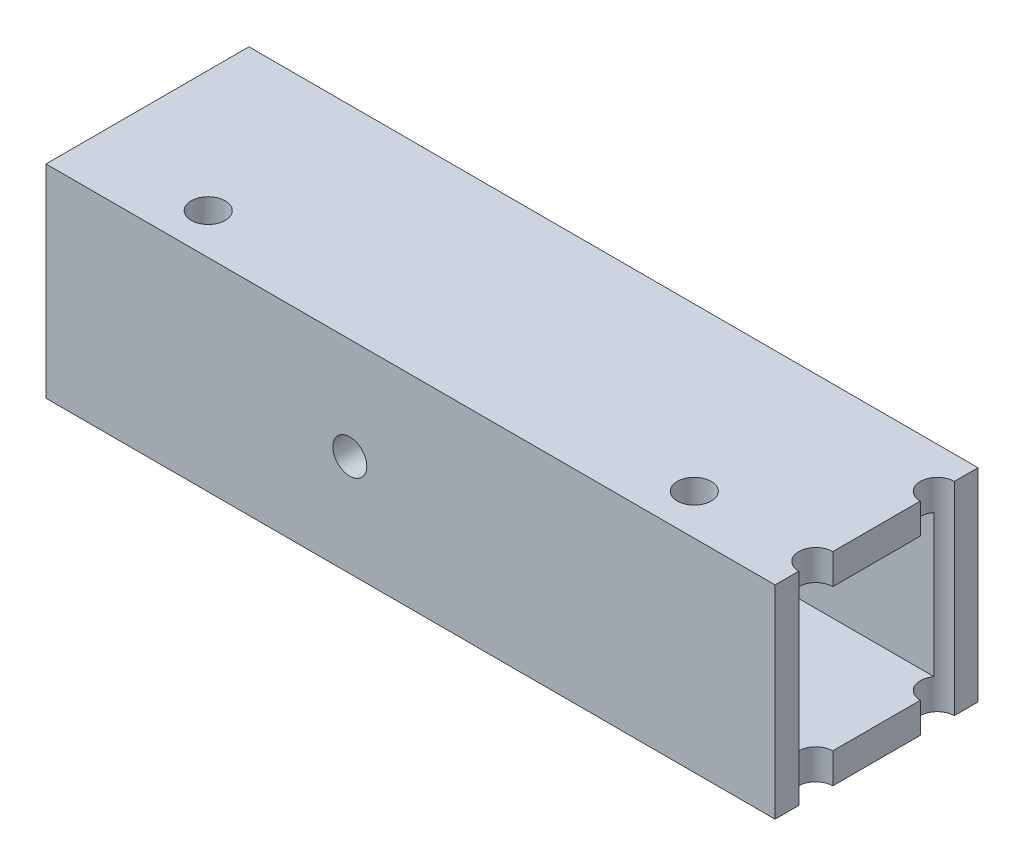
ISO-10303-21;
HEADER;
FILE_DESCRIPTION(('STEP AP214'),'2;1');
FILE_NAME('part.step','',(''),(''),'','','');
FILE_SCHEMA(('AUTOMOTIVE_DESIGN { 1 0 10303 214 1 1 1 1 }'));
ENDSEC;
DATA;
#1=APPLICATION_CONTEXT('core data for automotive mechanical design processes');
#2=APPLICATION_PROTOCOL_DEFINITION('international standard','automotive_design',2000,#1);
#3=PRODUCT_CONTEXT('',#1,'mechanical');
#4=PRODUCT('Part','Part','',(#3));
#5=PRODUCT_RELATED_PRODUCT_CATEGORY('part','',(#4));
#6=PRODUCT_DEFINITION_FORMATION('','',#4);
#7=PRODUCT_DEFINITION_CONTEXT('part definition',#1,'design');
#8=PRODUCT_DEFINITION('design','',#6,#7);
#9=PRODUCT_DEFINITION_SHAPE('','',#8);
#10=(LENGTH_UNIT() NAMED_UNIT(*) SI_UNIT(.MILLI.,.METRE.));
#11=(NAMED_UNIT(*) PLANE_ANGLE_UNIT() SI_UNIT($,.RADIAN.));
#12=(NAMED_UNIT(*) SI_UNIT($,.STERADIAN.) SOLID_ANGLE_UNIT());
#13=UNCERTAINTY_MEASURE_WITH_UNIT(LENGTH_MEASURE(1.E-05),#10,'distance_accuracy_value','');
#14=(GEOMETRIC_REPRESENTATION_CONTEXT(3) GLOBAL_UNCERTAINTY_ASSIGNED_CONTEXT((#13)) GLOBAL_UNIT_ASSIGNED_CONTEXT((#10,
#11,#12)) REPRESENTATION_CONTEXT('',''));
#15=CARTESIAN_POINT('',(0.,0.,0.));
#16=DIRECTION('',(0.,0.,1.));
#17=DIRECTION('',(1.,0.,0.));
#18=AXIS2_PLACEMENT_3D('',#15,#16,#17);
#19=CARTESIAN_POINT('',(-151.,-133.7,131.7));
#20=DIRECTION('',(0.,0.,1.));
#21=DIRECTION('',(1.,0.,0.));
#22=AXIS2_PLACEMENT_3D('',#19,#20,#21);
#23=PLANE('',#22);
#24=CARTESIAN_POINT('',(-100.,-122.,131.7));
#25=DIRECTION('',(0.,0.,1.));
#26=DIRECTION('',(1.,0.,0.));
#27=AXIS2_PLACEMENT_3D('',#24,#25,#26);
#28=CIRCLE('',#27,2.8);
#29=CARTESIAN_POINT('',(-97.2,-122.,131.7));
#30=VERTEX_POINT('',#29);
#31=EDGE_CURVE('E29',#30,#30,#28,.T.);
#32=ORIENTED_EDGE('',*,*,#31,.T.);
#33=EDGE_LOOP('',(#32));
#34=FACE_BOUND('',#33,.T.);
#35=DIRECTION('',(0.,-1.,0.));
#36=VECTOR('',#35,1.);
#37=CARTESIAN_POINT('',(-52.22485954612,-100.,131.7));
#38=LINE('',#37,#36);
#39=CARTESIAN_POINT('',(-52.22485954613,-110.3,131.7));
#40=VERTEX_POINT('',#39);
#41=CARTESIAN_POINT('',(-52.22485954613,-133.7,131.7));
#42=VERTEX_POINT('',#41);
#43=EDGE_CURVE('E320',#40,#42,#38,.T.);
#44=ORIENTED_EDGE('',*,*,#43,.T.);
#45=DIRECTION('',(1.,0.,0.));
#46=VECTOR('',#45,1.);
#47=CARTESIAN_POINT('',(-151.,-133.7,131.7));
#48=LINE('',#47,#46);
#49=CARTESIAN_POINT('',(-127.7751404538,-133.7,131.7));
#50=VERTEX_POINT('',#49);
#51=EDGE_CURVE('E333',#50,#42,#48,.T.);
#52=ORIENTED_EDGE('',*,*,#51,.F.);
#53=DIRECTION('',(0.,-1.,0.));
#54=VECTOR('',#53,1.);
#55=CARTESIAN_POINT('',(-127.7751404538,-100.,131.7));
#56=LINE('',#55,#54);
#57=CARTESIAN_POINT('',(-127.7751404538,-110.3,131.7));
#58=VERTEX_POINT('',#57);
#59=EDGE_CURVE('E312',#58,#50,#56,.T.);
#60=ORIENTED_EDGE('',*,*,#59,.F.);
#61=DIRECTION('',(1.,0.,0.));
#62=VECTOR('',#61,1.);
#63=CARTESIAN_POINT('',(-151.,-110.3,131.7));
#64=LINE('',#63,#62);
#65=EDGE_CURVE('E348',#58,#40,#64,.T.);
#66=ORIENTED_EDGE('',*,*,#65,.T.);
#67=EDGE_LOOP('',(#44,#52,#60,#66));
#68=FACE_BOUND('',#67,.T.);
#69=ADVANCED_FACE('F20',(#34,#68),#23,.F.);
#70=CARTESIAN_POINT('',(-151.,-133.7,131.7));
#71=DIRECTION('',(0.,0.,1.));
#72=DIRECTION('',(1.,0.,0.));
#73=AXIS2_PLACEMENT_3D('',#70,#71,#72);
#74=PLANE('',#73);
#75=DIRECTION('',(0.,-1.,0.));
#76=VECTOR('',#75,1.);
#77=CARTESIAN_POINT('',(-32.22485954612,-100.,131.7));
#78=LINE('',#77,#76);
#79=CARTESIAN_POINT('',(-32.22485954613,-110.3,131.7));
#80=VERTEX_POINT('',#79);
#81=CARTESIAN_POINT('',(-32.22485954613,-133.7,131.7));
#82=VERTEX_POINT('',#81);
#83=EDGE_CURVE('E214',#80,#82,#78,.T.);
#84=ORIENTED_EDGE('',*,*,#83,.T.);
#85=DIRECTION('',(1.,0.,0.));
#86=VECTOR('',#85,1.);
#87=CARTESIAN_POINT('',(-151.,-133.7,131.7));
#88=LINE('',#87,#86);
#89=CARTESIAN_POINT('',(-47.77514045387,-133.7,131.7));
#90=VERTEX_POINT('',#89);
#91=EDGE_CURVE('E229',#90,#82,#88,.T.);
#92=ORIENTED_EDGE('',*,*,#91,.F.);
#93=DIRECTION('',(0.,-1.,0.));
#94=VECTOR('',#93,1.);
#95=CARTESIAN_POINT('',(-47.77514045387,-100.,131.7));
#96=LINE('',#95,#94);
#97=CARTESIAN_POINT('',(-47.77514045387,-110.3,131.7));
#98=VERTEX_POINT('',#97);
#99=EDGE_CURVE('E316',#98,#90,#96,.T.);
#100=ORIENTED_EDGE('',*,*,#99,.F.);
#101=DIRECTION('',(1.,0.,0.));
#102=VECTOR('',#101,1.);
#103=CARTESIAN_POINT('',(-151.,-110.3,131.7));
#104=LINE('',#103,#102);
#105=EDGE_CURVE('E395',#98,#80,#104,.T.);
#106=ORIENTED_EDGE('',*,*,#105,.T.);
#107=EDGE_LOOP('',(#84,#92,#100,#106));
#108=FACE_BOUND('',#107,.T.);
#109=ADVANCED_FACE('F394',(#108),#74,.F.);
#110=CARTESIAN_POINT('',(-30.,-138.7,103.3));
#111=DIRECTION('',(1.,0.,0.));
#112=DIRECTION('',(0.,1.,0.));
#113=AXIS2_PLACEMENT_3D('',#110,#111,#112);
#114=PLANE('',#113);
#115=DIRECTION('',(0.,-1.,0.));
#116=VECTOR('',#115,1.);
#117=CARTESIAN_POINT('',(-30.,-100.,112.8));
#118=LINE('',#117,#116);
#119=CARTESIAN_POINT('',(-30.,-105.3,112.79999999999));
#120=VERTEX_POINT('',#119);
#121=CARTESIAN_POINT('',(-30.,-110.3,112.79999999999));
#122=VERTEX_POINT('',#121);
#123=EDGE_CURVE('E245',#120,#122,#118,.T.);
#124=ORIENTED_EDGE('',*,*,#123,.F.);
#125=DIRECTION('',(0.,0.,1.));
#126=VECTOR('',#125,1.);
#127=CARTESIAN_POINT('',(-30.,-105.3,103.3));
#128=LINE('',#127,#126);
#129=CARTESIAN_POINT('',(-30.,-105.3,127.2));
#130=VERTEX_POINT('',#129);
#131=EDGE_CURVE('E413',#120,#130,#128,.T.);
#132=ORIENTED_EDGE('',*,*,#131,.T.);
#133=DIRECTION('',(0.,-1.,0.));
#134=VECTOR('',#133,1.);
#135=CARTESIAN_POINT('',(-30.,-100.,127.2));
#136=LINE('',#135,#134);
#137=CARTESIAN_POINT('',(-30.,-110.3,127.2));
#138=VERTEX_POINT('',#137);
#139=EDGE_CURVE('E300',#130,#138,#136,.T.);
#140=ORIENTED_EDGE('',*,*,#139,.T.);
#141=DIRECTION('',(0.,0.,1.));
#142=VECTOR('',#141,1.);
#143=CARTESIAN_POINT('',(-30.,-110.3,105.8));
#144=LINE('',#143,#142);
#145=EDGE_CURVE('E459',#122,#138,#144,.T.);
#146=ORIENTED_EDGE('',*,*,#145,.F.);
#147=EDGE_LOOP('',(#124,#132,#140,#146));
#148=FACE_BOUND('',#147,.T.);
#149=ADVANCED_FACE('F550',(#148),#114,.T.);
#150=CARTESIAN_POINT('',(-100.,-122.,98.));
#151=DIRECTION('',(0.,0.,1.));
#152=DIRECTION('',(1.,0.,0.));
#153=AXIS2_PLACEMENT_3D('',#150,#151,#152);
#154=CYLINDRICAL_SURFACE('',#153,2.8);
#155=DIRECTION('',(0.,0.,1.));
#156=VECTOR('',#155,1.);
#157=CARTESIAN_POINT('',(-97.2,-122.,98.));
#158=LINE('',#157,#156);
#159=CARTESIAN_POINT('',(-97.2,-122.,103.3));
#160=VERTEX_POINT('',#159);
#161=CARTESIAN_POINT('',(-97.2,-122.,108.3));
#162=VERTEX_POINT('',#161);
#163=EDGE_CURVE('E12',#160,#162,#158,.T.);
#164=ORIENTED_EDGE('',*,*,#163,.F.);
#165=CARTESIAN_POINT('',(-100.,-122.,103.3));
#166=DIRECTION('',(0.,0.,1.));
#167=DIRECTION('',(1.,0.,0.));
#168=AXIS2_PLACEMENT_3D('',#165,#166,#167);
#169=CIRCLE('',#168,2.8);
#170=EDGE_CURVE('E685',#160,#160,#169,.T.);
#171=ORIENTED_EDGE('',*,*,#170,.F.);
#172=ORIENTED_EDGE('',*,*,#163,.T.);
#173=CARTESIAN_POINT('',(-100.,-122.,108.3));
#174=DIRECTION('',(0.,0.,1.));
#175=DIRECTION('',(1.,0.,0.));
#176=AXIS2_PLACEMENT_3D('',#173,#174,#175);
#177=CIRCLE('',#176,2.8);
#178=EDGE_CURVE('E460',#162,#162,#177,.T.);
#179=ORIENTED_EDGE('',*,*,#178,.T.);
#180=EDGE_LOOP('',(#164,#171,#172,#179));
#181=FACE_BOUND('',#180,.T.);
#182=ADVANCED_FACE('F749',(#181),#154,.F.);
#183=CARTESIAN_POINT('',(-100.,-122.,98.));
#184=DIRECTION('',(0.,0.,1.));
#185=DIRECTION('',(1.,0.,0.));
#186=AXIS2_PLACEMENT_3D('',#183,#184,#185);
#187=CYLINDRICAL_SURFACE('',#186,2.8);
#188=DIRECTION('',(0.,0.,1.));
#189=VECTOR('',#188,1.);
#190=CARTESIAN_POINT('',(-97.2,-122.,98.));
#191=LINE('',#190,#189);
#192=CARTESIAN_POINT('',(-97.2,-122.,136.7));
#193=VERTEX_POINT('',#192);
#194=EDGE_CURVE('E313',#30,#193,#191,.T.);
#195=ORIENTED_EDGE('',*,*,#194,.F.);
#196=ORIENTED_EDGE('',*,*,#31,.F.);
#197=ORIENTED_EDGE('',*,*,#194,.T.);
#198=CARTESIAN_POINT('',(-100.,-122.,136.7));
#199=DIRECTION('',(0.,0.,1.));
#200=DIRECTION('',(1.,0.,0.));
#201=AXIS2_PLACEMENT_3D('',#198,#199,#200);
#202=CIRCLE('',#201,2.8);
#203=EDGE_CURVE('E440',#193,#193,#202,.T.);
#204=ORIENTED_EDGE('',*,*,#203,.T.);
#205=EDGE_LOOP('',(#195,#196,#197,#204));
#206=FACE_BOUND('',#205,.T.);
#207=ADVANCED_FACE('F744',(#206),#187,.F.);
#208=CARTESIAN_POINT('',(-50.,-100.,130.));
#209=DIRECTION('',(0.,-1.,0.));
#210=DIRECTION('',(1.,0.,0.));
#211=AXIS2_PLACEMENT_3D('',#208,#209,#210);
#212=CYLINDRICAL_SURFACE('',#211,2.8);
#213=DIRECTION('',(0.,-1.,0.));
#214=VECTOR('',#213,1.);
#215=CARTESIAN_POINT('',(-47.2,-100.,130.));
#216=LINE('',#215,#214);
#217=CARTESIAN_POINT('',(-47.2,-133.7,130.));
#218=VERTEX_POINT('',#217);
#219=CARTESIAN_POINT('',(-47.2,-138.7,130.));
#220=VERTEX_POINT('',#219);
#221=EDGE_CURVE('E319',#218,#220,#216,.T.);
#222=ORIENTED_EDGE('',*,*,#221,.F.);
#223=CARTESIAN_POINT('',(-50.,-133.7,130.));
#224=DIRECTION('',(0.,-1.,0.));
#225=DIRECTION('',(1.,0.,0.));
#226=AXIS2_PLACEMENT_3D('',#223,#224,#225);
#227=CIRCLE('',#226,2.8);
#228=EDGE_CURVE('E270',#42,#218,#227,.T.);
#229=ORIENTED_EDGE('',*,*,#228,.F.);
#230=ORIENTED_EDGE('',*,*,#43,.F.);
#231=CARTESIAN_POINT('',(-50.,-110.3,130.));
#232=DIRECTION('',(0.,-1.,0.));
#233=DIRECTION('',(1.,0.,0.));
#234=AXIS2_PLACEMENT_3D('',#231,#232,#233);
#235=CIRCLE('',#234,2.8);
#236=CARTESIAN_POINT('',(-47.2,-110.3,130.));
#237=VERTEX_POINT('',#236);
#238=EDGE_CURVE('E346',#40,#237,#235,.T.);
#239=ORIENTED_EDGE('',*,*,#238,.T.);
#240=DIRECTION('',(0.,-1.,0.));
#241=VECTOR('',#240,1.);
#242=CARTESIAN_POINT('',(-47.2,-100.,130.));
#243=LINE('',#242,#241);
#244=CARTESIAN_POINT('',(-47.2,-105.3,130.));
#245=VERTEX_POINT('',#244);
#246=EDGE_CURVE('E323',#245,#237,#243,.T.);
#247=ORIENTED_EDGE('',*,*,#246,.F.);
#248=CARTESIAN_POINT('',(-50.,-105.3,130.));
#249=DIRECTION('',(0.,-1.,0.));
#250=DIRECTION('',(1.,0.,0.));
#251=AXIS2_PLACEMENT_3D('',#248,#249,#250);
#252=CIRCLE('',#251,2.8);
#253=EDGE_CURVE('E423',#245,#245,#252,.T.);
#254=ORIENTED_EDGE('',*,*,#253,.F.);
#255=ORIENTED_EDGE('',*,*,#246,.T.);
#256=CARTESIAN_POINT('',(-50.,-110.3,130.));
#257=DIRECTION('',(0.,-1.,0.));
#258=DIRECTION('',(1.,0.,0.));
#259=AXIS2_PLACEMENT_3D('',#256,#257,#258);
#260=CIRCLE('',#259,2.8);
#261=EDGE_CURVE('E291',#237,#98,#260,.T.);
#262=ORIENTED_EDGE('',*,*,#261,.T.);
#263=ORIENTED_EDGE('',*,*,#99,.T.);
#264=CARTESIAN_POINT('',(-50.,-133.7,130.));
#265=DIRECTION('',(0.,-1.,0.));
#266=DIRECTION('',(1.,0.,0.));
#267=AXIS2_PLACEMENT_3D('',#264,#265,#266);
#268=CIRCLE('',#267,2.8);
#269=EDGE_CURVE('E235',#218,#90,#268,.T.);
#270=ORIENTED_EDGE('',*,*,#269,.F.);
#271=ORIENTED_EDGE('',*,*,#221,.T.);
#272=CARTESIAN_POINT('',(-50.,-138.7,130.));
#273=DIRECTION('',(0.,-1.,0.));
#274=DIRECTION('',(1.,0.,0.));
#275=AXIS2_PLACEMENT_3D('',#272,#273,#274);
#276=CIRCLE('',#275,2.8);
#277=EDGE_CURVE('E289',#220,#220,#276,.T.);
#278=ORIENTED_EDGE('',*,*,#277,.T.);
#279=EDGE_LOOP('',(#222,#229,#230,#239,#247,#254,#255,#262,#263,#270,#271,#278));
#280=FACE_BOUND('',#279,.T.);
#281=ADVANCED_FACE('F384',(#280),#212,.F.);
#282=CARTESIAN_POINT('',(-130.,-100.,130.));
#283=DIRECTION('',(0.,-1.,0.));
#284=DIRECTION('',(1.,0.,0.));
#285=AXIS2_PLACEMENT_3D('',#282,#283,#284);
#286=CYLINDRICAL_SURFACE('',#285,2.8);
#287=DIRECTION('',(0.,-1.,0.));
#288=VECTOR('',#287,1.);
#289=CARTESIAN_POINT('',(-127.2,-100.,130.));
#290=LINE('',#289,#288);
#291=CARTESIAN_POINT('',(-127.2,-133.7,130.));
#292=VERTEX_POINT('',#291);
#293=CARTESIAN_POINT('',(-127.2,-138.7,130.));
#294=VERTEX_POINT('',#293);
#295=EDGE_CURVE('E306',#292,#294,#290,.T.);
#296=ORIENTED_EDGE('',*,*,#295,.F.);
#297=CARTESIAN_POINT('',(-130.,-133.7,130.));
#298=DIRECTION('',(0.,-1.,0.));
#299=DIRECTION('',(1.,0.,0.));
#300=AXIS2_PLACEMENT_3D('',#297,#298,#299);
#301=CIRCLE('',#300,2.8);
#302=CARTESIAN_POINT('',(-132.2248595461,-133.7,131.7));
#303=VERTEX_POINT('',#302);
#304=EDGE_CURVE('E343',#303,#292,#301,.T.);
#305=ORIENTED_EDGE('',*,*,#304,.F.);
#306=DIRECTION('',(0.,-1.,0.));
#307=VECTOR('',#306,1.);
#308=CARTESIAN_POINT('',(-132.2248595461,-100.,131.7));
#309=LINE('',#308,#307);
#310=CARTESIAN_POINT('',(-132.2248595461,-110.3,131.7));
#311=VERTEX_POINT('',#310);
#312=EDGE_CURVE('E366',#311,#303,#309,.T.);
#313=ORIENTED_EDGE('',*,*,#312,.F.);
#314=CARTESIAN_POINT('',(-130.,-110.3,130.));
#315=DIRECTION('',(0.,-1.,0.));
#316=DIRECTION('',(1.,0.,0.));
#317=AXIS2_PLACEMENT_3D('',#314,#315,#316);
#318=CIRCLE('',#317,2.8);
#319=CARTESIAN_POINT('',(-127.2,-110.3,130.));
#320=VERTEX_POINT('',#319);
#321=EDGE_CURVE('E358',#311,#320,#318,.T.);
#322=ORIENTED_EDGE('',*,*,#321,.T.);
#323=DIRECTION('',(0.,-1.,0.));
#324=VECTOR('',#323,1.);
#325=CARTESIAN_POINT('',(-127.2,-100.,130.));
#326=LINE('',#325,#324);
#327=CARTESIAN_POINT('',(-127.2,-105.3,130.));
#328=VERTEX_POINT('',#327);
#329=EDGE_CURVE('E309',#328,#320,#326,.T.);
#330=ORIENTED_EDGE('',*,*,#329,.F.);
#331=CARTESIAN_POINT('',(-130.,-105.3,130.));
#332=DIRECTION('',(0.,-1.,0.));
#333=DIRECTION('',(1.,0.,0.));
#334=AXIS2_PLACEMENT_3D('',#331,#332,#333);
#335=CIRCLE('',#334,2.8);
#336=EDGE_CURVE('E418',#328,#328,#335,.T.);
#337=ORIENTED_EDGE('',*,*,#336,.F.);
#338=ORIENTED_EDGE('',*,*,#329,.T.);
#339=CARTESIAN_POINT('',(-130.,-110.3,130.));
#340=DIRECTION('',(0.,-1.,0.));
#341=DIRECTION('',(1.,0.,0.));
#342=AXIS2_PLACEMENT_3D('',#339,#340,#341);
#343=CIRCLE('',#342,2.8);
#344=EDGE_CURVE('E352',#320,#58,#343,.T.);
#345=ORIENTED_EDGE('',*,*,#344,.T.);
#346=ORIENTED_EDGE('',*,*,#59,.T.);
#347=CARTESIAN_POINT('',(-130.,-133.7,130.));
#348=DIRECTION('',(0.,-1.,0.));
#349=DIRECTION('',(1.,0.,0.));
#350=AXIS2_PLACEMENT_3D('',#347,#348,#349);
#351=CIRCLE('',#350,2.8);
#352=EDGE_CURVE('E329',#292,#50,#351,.T.);
#353=ORIENTED_EDGE('',*,*,#352,.F.);
#354=ORIENTED_EDGE('',*,*,#295,.T.);
#355=CARTESIAN_POINT('',(-130.,-138.7,130.));
#356=DIRECTION('',(0.,-1.,0.));
#357=DIRECTION('',(1.,0.,0.));
#358=AXIS2_PLACEMENT_3D('',#355,#356,#357);
#359=CIRCLE('',#358,2.8);
#360=EDGE_CURVE('E284',#294,#294,#359,.T.);
#361=ORIENTED_EDGE('',*,*,#360,.T.);
#362=EDGE_LOOP('',(#296,#305,#313,#322,#330,#337,#338,#345,#346,#353,#354,#361));
#363=FACE_BOUND('',#362,.T.);
#364=ADVANCED_FACE('F376',(#363),#286,.F.);
#365=CARTESIAN_POINT('',(-30.,-138.7,103.3));
#366=DIRECTION('',(1.,0.,0.));
#367=DIRECTION('',(0.,1.,0.));
#368=AXIS2_PLACEMENT_3D('',#365,#366,#367);
#369=PLANE('',#368);
#370=DIRECTION('',(0.,0.,1.));
#371=VECTOR('',#370,1.);
#372=CARTESIAN_POINT('',(-30.,-138.7,103.3));
#373=LINE('',#372,#371);
#374=CARTESIAN_POINT('',(-30.,-138.7,132.8));
#375=VERTEX_POINT('',#374);
#376=CARTESIAN_POINT('',(-30.,-138.7,136.7));
#377=VERTEX_POINT('',#376);
#378=EDGE_CURVE('E258',#375,#377,#373,.T.);
#379=ORIENTED_EDGE('',*,*,#378,.F.);
#380=DIRECTION('',(0.,-1.,0.));
#381=VECTOR('',#380,1.);
#382=CARTESIAN_POINT('',(-30.,-100.,132.8));
#383=LINE('',#382,#381);
#384=CARTESIAN_POINT('',(-30.,-105.3,132.8));
#385=VERTEX_POINT('',#384);
#386=EDGE_CURVE('E303',#385,#375,#383,.T.);
#387=ORIENTED_EDGE('',*,*,#386,.F.);
#388=DIRECTION('',(0.,0.,1.));
#389=VECTOR('',#388,1.);
#390=CARTESIAN_POINT('',(-30.,-105.3,103.3));
#391=LINE('',#390,#389);
#392=CARTESIAN_POINT('',(-30.,-105.3,136.7));
#393=VERTEX_POINT('',#392);
#394=EDGE_CURVE('E406',#385,#393,#391,.T.);
#395=ORIENTED_EDGE('',*,*,#394,.T.);
#396=DIRECTION('',(0.,1.,0.));
#397=VECTOR('',#396,1.);
#398=CARTESIAN_POINT('',(-30.,-138.7,136.7));
#399=LINE('',#398,#397);
#400=EDGE_CURVE('E562',#377,#393,#399,.T.);
#401=ORIENTED_EDGE('',*,*,#400,.F.);
#402=EDGE_LOOP('',(#379,#387,#395,#401));
#403=FACE_BOUND('',#402,.T.);
#404=ADVANCED_FACE('F561',(#403),#369,.T.);
#405=CARTESIAN_POINT('',(-30.,-100.,130.));
#406=DIRECTION('',(0.,-1.,0.));
#407=DIRECTION('',(1.,0.,0.));
#408=AXIS2_PLACEMENT_3D('',#405,#406,#407);
#409=CYLINDRICAL_SURFACE('',#408,2.8);
#410=DIRECTION('',(0.,-1.,0.));
#411=VECTOR('',#410,1.);
#412=CARTESIAN_POINT('',(-30.,-100.,127.2));
#413=LINE('',#412,#411);
#414=CARTESIAN_POINT('',(-30.,-133.7,127.2));
#415=VERTEX_POINT('',#414);
#416=CARTESIAN_POINT('',(-30.,-138.7,127.2));
#417=VERTEX_POINT('',#416);
#418=EDGE_CURVE('E200',#415,#417,#413,.T.);
#419=ORIENTED_EDGE('',*,*,#418,.F.);
#420=CARTESIAN_POINT('',(-30.,-133.7,130.));
#421=DIRECTION('',(0.,-1.,0.));
#422=DIRECTION('',(1.,0.,0.));
#423=AXIS2_PLACEMENT_3D('',#420,#421,#422);
#424=CIRCLE('',#423,2.8);
#425=EDGE_CURVE('E204',#82,#415,#424,.T.);
#426=ORIENTED_EDGE('',*,*,#425,.F.);
#427=ORIENTED_EDGE('',*,*,#83,.F.);
#428=CARTESIAN_POINT('',(-30.,-110.3,130.));
#429=DIRECTION('',(0.,-1.,0.));
#430=DIRECTION('',(1.,0.,0.));
#431=AXIS2_PLACEMENT_3D('',#428,#429,#430);
#432=CIRCLE('',#431,2.8);
#433=EDGE_CURVE('E534',#80,#138,#432,.T.);
#434=ORIENTED_EDGE('',*,*,#433,.T.);
#435=ORIENTED_EDGE('',*,*,#139,.F.);
#436=CARTESIAN_POINT('',(-30.,-105.3,130.));
#437=DIRECTION('',(0.,-1.,0.));
#438=DIRECTION('',(1.,0.,0.));
#439=AXIS2_PLACEMENT_3D('',#436,#437,#438);
#440=CIRCLE('',#439,2.8);
#441=EDGE_CURVE('E409',#385,#130,#440,.T.);
#442=ORIENTED_EDGE('',*,*,#441,.F.);
#443=ORIENTED_EDGE('',*,*,#386,.T.);
#444=CARTESIAN_POINT('',(-30.,-138.7,130.));
#445=DIRECTION('',(0.,-1.,0.));
#446=DIRECTION('',(1.,0.,0.));
#447=AXIS2_PLACEMENT_3D('',#444,#445,#446);
#448=CIRCLE('',#447,2.8);
#449=EDGE_CURVE('E209',#375,#417,#448,.T.);
#450=ORIENTED_EDGE('',*,*,#449,.T.);
#451=EDGE_LOOP('',(#419,#426,#427,#434,#435,#442,#443,#450));
#452=FACE_BOUND('',#451,.T.);
#453=ADVANCED_FACE('F202',(#452),#409,.F.);
#454=CARTESIAN_POINT('',(-30.,-138.7,103.3));
#455=DIRECTION('',(1.,0.,0.));
#456=DIRECTION('',(0.,1.,0.));
#457=AXIS2_PLACEMENT_3D('',#454,#455,#456);
#458=PLANE('',#457);
#459=DIRECTION('',(0.,0.,1.));
#460=VECTOR('',#459,1.);
#461=CARTESIAN_POINT('',(-30.,-138.7,103.3));
#462=LINE('',#461,#460);
#463=CARTESIAN_POINT('',(-30.,-138.7,112.79999999999));
#464=VERTEX_POINT('',#463);
#465=EDGE_CURVE('E469',#464,#417,#462,.T.);
#466=ORIENTED_EDGE('',*,*,#465,.F.);
#467=DIRECTION('',(0.,-1.,0.));
#468=VECTOR('',#467,1.);
#469=CARTESIAN_POINT('',(-30.,-100.,112.8));
#470=LINE('',#469,#468);
#471=CARTESIAN_POINT('',(-30.,-133.7,112.79999999999));
#472=VERTEX_POINT('',#471);
#473=EDGE_CURVE('E215',#472,#464,#470,.T.);
#474=ORIENTED_EDGE('',*,*,#473,.F.);
#475=DIRECTION('',(0.,0.,1.));
#476=VECTOR('',#475,1.);
#477=CARTESIAN_POINT('',(-30.,-133.7,105.8));
#478=LINE('',#477,#476);
#479=EDGE_CURVE('E218',#472,#415,#478,.T.);
#480=ORIENTED_EDGE('',*,*,#479,.T.);
#481=ORIENTED_EDGE('',*,*,#418,.T.);
#482=EDGE_LOOP('',(#466,#474,#480,#481));
#483=FACE_BOUND('',#482,.T.);
#484=ADVANCED_FACE('F219',(#483),#458,.T.);
#485=CARTESIAN_POINT('',(-30.,-100.,110.));
#486=DIRECTION('',(0.,-1.,0.));
#487=DIRECTION('',(1.,0.,0.));
#488=AXIS2_PLACEMENT_3D('',#485,#486,#487);
#489=CYLINDRICAL_SURFACE('',#488,2.8);
#490=DIRECTION('',(0.,-1.,0.));
#491=VECTOR('',#490,1.);
#492=CARTESIAN_POINT('',(-30.,-100.,107.2));
#493=LINE('',#492,#491);
#494=CARTESIAN_POINT('',(-30.,-105.3,107.2));
#495=VERTEX_POINT('',#494);
#496=CARTESIAN_POINT('',(-30.,-138.7,107.2));
#497=VERTEX_POINT('',#496);
#498=EDGE_CURVE('E240',#495,#497,#493,.T.);
#499=ORIENTED_EDGE('',*,*,#498,.F.);
#500=CARTESIAN_POINT('',(-30.,-105.3,110.));
#501=DIRECTION('',(0.,-1.,0.));
#502=DIRECTION('',(1.,0.,0.));
#503=AXIS2_PLACEMENT_3D('',#500,#501,#502);
#504=CIRCLE('',#503,2.8);
#505=EDGE_CURVE('E417',#120,#495,#504,.T.);
#506=ORIENTED_EDGE('',*,*,#505,.F.);
#507=ORIENTED_EDGE('',*,*,#123,.T.);
#508=CARTESIAN_POINT('',(-30.,-110.3,110.));
#509=DIRECTION('',(0.,-1.,0.));
#510=DIRECTION('',(1.,0.,0.));
#511=AXIS2_PLACEMENT_3D('',#508,#509,#510);
#512=CIRCLE('',#511,2.8);
#513=CARTESIAN_POINT('',(-32.22485954612,-110.3,108.3));
#514=VERTEX_POINT('',#513);
#515=EDGE_CURVE('E455',#122,#514,#512,.T.);
#516=ORIENTED_EDGE('',*,*,#515,.T.);
#517=DIRECTION('',(0.,-1.,0.));
#518=VECTOR('',#517,1.);
#519=CARTESIAN_POINT('',(-32.22485954612,-100.,108.3));
#520=LINE('',#519,#518);
#521=CARTESIAN_POINT('',(-32.22485954612,-133.7,108.3));
#522=VERTEX_POINT('',#521);
#523=EDGE_CURVE('E461',#514,#522,#520,.T.);
#524=ORIENTED_EDGE('',*,*,#523,.T.);
#525=CARTESIAN_POINT('',(-30.,-133.7,110.));
#526=DIRECTION('',(0.,-1.,0.));
#527=DIRECTION('',(1.,0.,0.));
#528=AXIS2_PLACEMENT_3D('',#525,#526,#527);
#529=CIRCLE('',#528,2.8);
#530=EDGE_CURVE('E224',#472,#522,#529,.T.);
#531=ORIENTED_EDGE('',*,*,#530,.F.);
#532=ORIENTED_EDGE('',*,*,#473,.T.);
#533=CARTESIAN_POINT('',(-30.,-138.7,110.));
#534=DIRECTION('',(0.,-1.,0.));
#535=DIRECTION('',(1.,0.,0.));
#536=AXIS2_PLACEMENT_3D('',#533,#534,#535);
#537=CIRCLE('',#536,2.8);
#538=EDGE_CURVE('E283',#464,#497,#537,.T.);
#539=ORIENTED_EDGE('',*,*,#538,.T.);
#540=EDGE_LOOP('',(#499,#506,#507,#516,#524,#531,#532,#539));
#541=FACE_BOUND('',#540,.T.);
#542=ADVANCED_FACE('F607',(#541),#489,.F.);
#543=CARTESIAN_POINT('',(-30.,-138.7,103.3));
#544=DIRECTION('',(1.,0.,0.));
#545=DIRECTION('',(0.,1.,0.));
#546=AXIS2_PLACEMENT_3D('',#543,#544,#545);
#547=PLANE('',#546);
#548=DIRECTION('',(0.,0.,1.));
#549=VECTOR('',#548,1.);
#550=CARTESIAN_POINT('',(-30.,-138.7,103.3));
#551=LINE('',#550,#549);
#552=CARTESIAN_POINT('',(-30.,-138.7,103.3));
#553=VERTEX_POINT('',#552);
#554=EDGE_CURVE('E290',#553,#497,#551,.T.);
#555=ORIENTED_EDGE('',*,*,#554,.F.);
#556=DIRECTION('',(0.,1.,0.));
#557=VECTOR('',#556,1.);
#558=CARTESIAN_POINT('',(-30.,-138.7,103.3));
#559=LINE('',#558,#557);
#560=CARTESIAN_POINT('',(-30.,-105.3,103.3));
#561=VERTEX_POINT('',#560);
#562=EDGE_CURVE('E439',#553,#561,#559,.T.);
#563=ORIENTED_EDGE('',*,*,#562,.T.);
#564=DIRECTION('',(0.,0.,1.));
#565=VECTOR('',#564,1.);
#566=CARTESIAN_POINT('',(-30.,-105.3,103.3));
#567=LINE('',#566,#565);
#568=EDGE_CURVE('E403',#561,#495,#567,.T.);
#569=ORIENTED_EDGE('',*,*,#568,.T.);
#570=ORIENTED_EDGE('',*,*,#498,.T.);
#571=EDGE_LOOP('',(#555,#563,#569,#570));
#572=FACE_BOUND('',#571,.T.);
#573=ADVANCED_FACE('F803',(#572),#547,.T.);
#574=CARTESIAN_POINT('',(-151.,-133.7,108.3));
#575=DIRECTION('',(0.,1.,0.));
#576=DIRECTION('',(1.,0.,0.));
#577=AXIS2_PLACEMENT_3D('',#574,#575,#576);
#578=PLANE('',#577);
#579=DIRECTION('',(1.,0.,0.));
#580=VECTOR('',#579,1.);
#581=CARTESIAN_POINT('',(-151.,-133.7,108.3));
#582=LINE('',#581,#580);
#583=CARTESIAN_POINT('',(-150.,-133.7,108.3));
#584=VERTEX_POINT('',#583);
#585=EDGE_CURVE('E465',#584,#522,#582,.T.);
#586=ORIENTED_EDGE('',*,*,#585,.F.);
#587=DIRECTION('',(0.,0.,1.));
#588=VECTOR('',#587,1.);
#589=CARTESIAN_POINT('',(-150.,-133.7,105.8));
#590=LINE('',#589,#588);
#591=CARTESIAN_POINT('',(-150.,-133.7,131.7));
#592=VERTEX_POINT('',#591);
#593=EDGE_CURVE('E275',#584,#592,#590,.T.);
#594=ORIENTED_EDGE('',*,*,#593,.T.);
#595=DIRECTION('',(1.,0.,0.));
#596=VECTOR('',#595,1.);
#597=CARTESIAN_POINT('',(-151.,-133.7,131.7));
#598=LINE('',#597,#596);
#599=EDGE_CURVE('E367',#592,#303,#598,.T.);
#600=ORIENTED_EDGE('',*,*,#599,.T.);
#601=ORIENTED_EDGE('',*,*,#304,.T.);
#602=ORIENTED_EDGE('',*,*,#352,.T.);
#603=ORIENTED_EDGE('',*,*,#51,.T.);
#604=ORIENTED_EDGE('',*,*,#228,.T.);
#605=ORIENTED_EDGE('',*,*,#269,.T.);
#606=ORIENTED_EDGE('',*,*,#91,.T.);
#607=ORIENTED_EDGE('',*,*,#425,.T.);
#608=ORIENTED_EDGE('',*,*,#479,.F.);
#609=ORIENTED_EDGE('',*,*,#530,.T.);
#610=EDGE_LOOP('',(#586,#594,#600,#601,#602,#603,#604,#605,#606,#607,#608,#609));
#611=FACE_BOUND('',#610,.T.);
#612=ADVANCED_FACE('F226',(#611),#578,.T.);
#613=CARTESIAN_POINT('',(-151.,-133.7,131.7));
#614=DIRECTION('',(0.,0.,1.));
#615=DIRECTION('',(1.,0.,0.));
#616=AXIS2_PLACEMENT_3D('',#613,#614,#615);
#617=PLANE('',#616);
#618=ORIENTED_EDGE('',*,*,#312,.T.);
#619=ORIENTED_EDGE('',*,*,#599,.F.);
#620=DIRECTION('',(0.,-1.,0.));
#621=VECTOR('',#620,1.);
#622=CARTESIAN_POINT('',(-150.,-136.2,131.7));
#623=LINE('',#622,#621);
#624=CARTESIAN_POINT('',(-150.,-110.3,131.7));
#625=VERTEX_POINT('',#624);
#626=EDGE_CURVE('E271',#625,#592,#623,.T.);
#627=ORIENTED_EDGE('',*,*,#626,.F.);
#628=DIRECTION('',(1.,0.,0.));
#629=VECTOR('',#628,1.);
#630=CARTESIAN_POINT('',(-151.,-110.3,131.7));
#631=LINE('',#630,#629);
#632=EDGE_CURVE('E361',#625,#311,#631,.T.);
#633=ORIENTED_EDGE('',*,*,#632,.T.);
#634=EDGE_LOOP('',(#618,#619,#627,#633));
#635=FACE_BOUND('',#634,.T.);
#636=ADVANCED_FACE('F514',(#635),#617,.F.);
#637=CARTESIAN_POINT('',(-151.,-110.3,108.3));
#638=DIRECTION('',(0.,1.,0.));
#639=DIRECTION('',(1.,0.,0.));
#640=AXIS2_PLACEMENT_3D('',#637,#638,#639);
#641=PLANE('',#640);
#642=ORIENTED_EDGE('',*,*,#515,.F.);
#643=ORIENTED_EDGE('',*,*,#145,.T.);
#644=ORIENTED_EDGE('',*,*,#433,.F.);
#645=ORIENTED_EDGE('',*,*,#105,.F.);
#646=ORIENTED_EDGE('',*,*,#261,.F.);
#647=ORIENTED_EDGE('',*,*,#238,.F.);
#648=ORIENTED_EDGE('',*,*,#65,.F.);
#649=ORIENTED_EDGE('',*,*,#344,.F.);
#650=ORIENTED_EDGE('',*,*,#321,.F.);
#651=ORIENTED_EDGE('',*,*,#632,.F.);
#652=DIRECTION('',(0.,0.,1.));
#653=VECTOR('',#652,1.);
#654=CARTESIAN_POINT('',(-150.,-110.3,105.8));
#655=LINE('',#654,#653);
#656=CARTESIAN_POINT('',(-150.,-110.3,108.3));
#657=VERTEX_POINT('',#656);
#658=EDGE_CURVE('E265',#657,#625,#655,.T.);
#659=ORIENTED_EDGE('',*,*,#658,.F.);
#660=DIRECTION('',(1.,0.,0.));
#661=VECTOR('',#660,1.);
#662=CARTESIAN_POINT('',(-151.,-110.3,108.3));
#663=LINE('',#662,#661);
#664=EDGE_CURVE('E511',#657,#514,#663,.T.);
#665=ORIENTED_EDGE('',*,*,#664,.T.);
#666=EDGE_LOOP('',(#642,#643,#644,#645,#646,#647,#648,#649,#650,#651,#659,#665));
#667=FACE_BOUND('',#666,.T.);
#668=ADVANCED_FACE('F510',(#667),#641,.F.);
#669=CARTESIAN_POINT('',(-151.,-133.7,108.3));
#670=DIRECTION('',(0.,0.,1.));
#671=DIRECTION('',(1.,0.,0.));
#672=AXIS2_PLACEMENT_3D('',#669,#670,#671);
#673=PLANE('',#672);
#674=ORIENTED_EDGE('',*,*,#178,.F.);
#675=EDGE_LOOP('',(#674));
#676=FACE_BOUND('',#675,.T.);
#677=ORIENTED_EDGE('',*,*,#664,.F.);
#678=DIRECTION('',(0.,-1.,0.));
#679=VECTOR('',#678,1.);
#680=CARTESIAN_POINT('',(-150.,-136.2,108.3));
#681=LINE('',#680,#679);
#682=EDGE_CURVE('E279',#657,#584,#681,.T.);
#683=ORIENTED_EDGE('',*,*,#682,.T.);
#684=ORIENTED_EDGE('',*,*,#585,.T.);
#685=ORIENTED_EDGE('',*,*,#523,.F.);
#686=EDGE_LOOP('',(#677,#683,#684,#685));
#687=FACE_BOUND('',#686,.T.);
#688=ADVANCED_FACE('F519',(#676,#687),#673,.T.);
#689=CARTESIAN_POINT('',(-150.,-105.3,103.3));
#690=DIRECTION('',(0.,1.,0.));
#691=DIRECTION('',(1.,0.,0.));
#692=AXIS2_PLACEMENT_3D('',#689,#690,#691);
#693=PLANE('',#692);
#694=ORIENTED_EDGE('',*,*,#253,.T.);
#695=EDGE_LOOP('',(#694));
#696=FACE_BOUND('',#695,.T.);
#697=ORIENTED_EDGE('',*,*,#336,.T.);
#698=EDGE_LOOP('',(#697));
#699=FACE_BOUND('',#698,.T.);
#700=ORIENTED_EDGE('',*,*,#568,.F.);
#701=DIRECTION('',(1.,0.,0.));
#702=VECTOR('',#701,1.);
#703=CARTESIAN_POINT('',(-150.,-105.3,103.3));
#704=LINE('',#703,#702);
#705=CARTESIAN_POINT('',(-150.,-105.3,103.3));
#706=VERTEX_POINT('',#705);
#707=EDGE_CURVE('E433',#706,#561,#704,.T.);
#708=ORIENTED_EDGE('',*,*,#707,.F.);
#709=DIRECTION('',(0.,0.,1.));
#710=VECTOR('',#709,1.);
#711=CARTESIAN_POINT('',(-150.,-105.3,103.3));
#712=LINE('',#711,#710);
#713=CARTESIAN_POINT('',(-150.,-105.3,136.7));
#714=VERTEX_POINT('',#713);
#715=EDGE_CURVE('E480',#706,#714,#712,.T.);
#716=ORIENTED_EDGE('',*,*,#715,.T.);
#717=DIRECTION('',(1.,0.,0.));
#718=VECTOR('',#717,1.);
#719=CARTESIAN_POINT('',(-150.,-105.3,136.7));
#720=LINE('',#719,#718);
#721=EDGE_CURVE('E479',#714,#393,#720,.T.);
#722=ORIENTED_EDGE('',*,*,#721,.T.);
#723=ORIENTED_EDGE('',*,*,#394,.F.);
#724=ORIENTED_EDGE('',*,*,#441,.T.);
#725=ORIENTED_EDGE('',*,*,#131,.F.);
#726=ORIENTED_EDGE('',*,*,#505,.T.);
#727=EDGE_LOOP('',(#700,#708,#716,#722,#723,#724,#725,#726));
#728=FACE_BOUND('',#727,.T.);
#729=ADVANCED_FACE('F554',(#696,#699,#728),#693,.T.);
#730=CARTESIAN_POINT('',(-150.,-138.7,103.3));
#731=DIRECTION('',(0.,0.,1.));
#732=DIRECTION('',(1.,0.,0.));
#733=AXIS2_PLACEMENT_3D('',#730,#731,#732);
#734=PLANE('',#733);
#735=ORIENTED_EDGE('',*,*,#170,.T.);
#736=EDGE_LOOP('',(#735));
#737=FACE_BOUND('',#736,.T.);
#738=ORIENTED_EDGE('',*,*,#707,.T.);
#739=ORIENTED_EDGE('',*,*,#562,.F.);
#740=DIRECTION('',(1.,0.,0.));
#741=VECTOR('',#740,1.);
#742=CARTESIAN_POINT('',(-150.,-138.7,103.3));
#743=LINE('',#742,#741);
#744=CARTESIAN_POINT('',(-150.,-138.7,103.3));
#745=VERTEX_POINT('',#744);
#746=EDGE_CURVE('E441',#745,#553,#743,.T.);
#747=ORIENTED_EDGE('',*,*,#746,.F.);
#748=DIRECTION('',(0.,1.,0.));
#749=VECTOR('',#748,1.);
#750=CARTESIAN_POINT('',(-150.,-138.7,103.3));
#751=LINE('',#750,#749);
#752=EDGE_CURVE('E481',#745,#706,#751,.T.);
#753=ORIENTED_EDGE('',*,*,#752,.T.);
#754=EDGE_LOOP('',(#738,#739,#747,#753));
#755=FACE_BOUND('',#754,.T.);
#756=ADVANCED_FACE('F586',(#737,#755),#734,.F.);
#757=CARTESIAN_POINT('',(-150.,-138.7,136.7));
#758=DIRECTION('',(0.,0.,1.));
#759=DIRECTION('',(1.,0.,0.));
#760=AXIS2_PLACEMENT_3D('',#757,#758,#759);
#761=PLANE('',#760);
#762=ORIENTED_EDGE('',*,*,#203,.F.);
#763=EDGE_LOOP('',(#762));
#764=FACE_BOUND('',#763,.T.);
#765=DIRECTION('',(0.,1.,0.));
#766=VECTOR('',#765,1.);
#767=CARTESIAN_POINT('',(-150.,-138.7,136.7));
#768=LINE('',#767,#766);
#769=CARTESIAN_POINT('',(-150.,-138.7,136.7));
#770=VERTEX_POINT('',#769);
#771=EDGE_CURVE('E595',#770,#714,#768,.T.);
#772=ORIENTED_EDGE('',*,*,#771,.F.);
#773=DIRECTION('',(1.,0.,0.));
#774=VECTOR('',#773,1.);
#775=CARTESIAN_POINT('',(-150.,-138.7,136.7));
#776=LINE('',#775,#774);
#777=EDGE_CURVE('E264',#770,#377,#776,.T.);
#778=ORIENTED_EDGE('',*,*,#777,.T.);
#779=ORIENTED_EDGE('',*,*,#400,.T.);
#780=ORIENTED_EDGE('',*,*,#721,.F.);
#781=EDGE_LOOP('',(#772,#778,#779,#780));
#782=FACE_BOUND('',#781,.T.);
#783=ADVANCED_FACE('F770',(#764,#782),#761,.T.);
#784=CARTESIAN_POINT('',(-150.,-138.7,103.3));
#785=DIRECTION('',(0.,1.,0.));
#786=DIRECTION('',(1.,0.,0.));
#787=AXIS2_PLACEMENT_3D('',#784,#785,#786);
#788=PLANE('',#787);
#789=ORIENTED_EDGE('',*,*,#277,.F.);
#790=EDGE_LOOP('',(#789));
#791=FACE_BOUND('',#790,.T.);
#792=ORIENTED_EDGE('',*,*,#360,.F.);
#793=EDGE_LOOP('',(#792));
#794=FACE_BOUND('',#793,.T.);
#795=ORIENTED_EDGE('',*,*,#538,.F.);
#796=ORIENTED_EDGE('',*,*,#465,.T.);
#797=ORIENTED_EDGE('',*,*,#449,.F.);
#798=ORIENTED_EDGE('',*,*,#378,.T.);
#799=ORIENTED_EDGE('',*,*,#777,.F.);
#800=DIRECTION('',(0.,0.,1.));
#801=VECTOR('',#800,1.);
#802=CARTESIAN_POINT('',(-150.,-138.7,103.3));
#803=LINE('',#802,#801);
#804=EDGE_CURVE('E485',#745,#770,#803,.T.);
#805=ORIENTED_EDGE('',*,*,#804,.F.);
#806=ORIENTED_EDGE('',*,*,#746,.T.);
#807=ORIENTED_EDGE('',*,*,#554,.T.);
#808=EDGE_LOOP('',(#795,#796,#797,#798,#799,#805,#806,#807));
#809=FACE_BOUND('',#808,.T.);
#810=ADVANCED_FACE('F594',(#791,#794,#809),#788,.F.);
#811=CARTESIAN_POINT('',(-150.,-138.7,103.3));
#812=DIRECTION('',(1.,0.,0.));
#813=DIRECTION('',(0.,1.,0.));
#814=AXIS2_PLACEMENT_3D('',#811,#812,#813);
#815=PLANE('',#814);
#816=ORIENTED_EDGE('',*,*,#658,.T.);
#817=ORIENTED_EDGE('',*,*,#626,.T.);
#818=ORIENTED_EDGE('',*,*,#593,.F.);
#819=ORIENTED_EDGE('',*,*,#682,.F.);
#820=EDGE_LOOP('',(#816,#817,#818,#819));
#821=FACE_BOUND('',#820,.T.);
#822=ORIENTED_EDGE('',*,*,#771,.T.);
#823=ORIENTED_EDGE('',*,*,#715,.F.);
#824=ORIENTED_EDGE('',*,*,#752,.F.);
#825=ORIENTED_EDGE('',*,*,#804,.T.);
#826=EDGE_LOOP('',(#822,#823,#824,#825));
#827=FACE_BOUND('',#826,.T.);
#828=ADVANCED_FACE('F504',(#821,#827),#815,.F.);
#829=CLOSED_SHELL('',(#69,#109,#149,#182,#207,#281,#364,#404,#453,#484,#542,#573,#612,#636,#668,
#688,#729,#756,#783,#810,#828));
#830=MANIFOLD_SOLID_BREP('B1',#829);
#831=ADVANCED_BREP_SHAPE_REPRESENTATION('',(#18,#830),#14);
#832=SHAPE_DEFINITION_REPRESENTATION(#9,#831);
ENDSEC;
END-ISO-10303-21;
